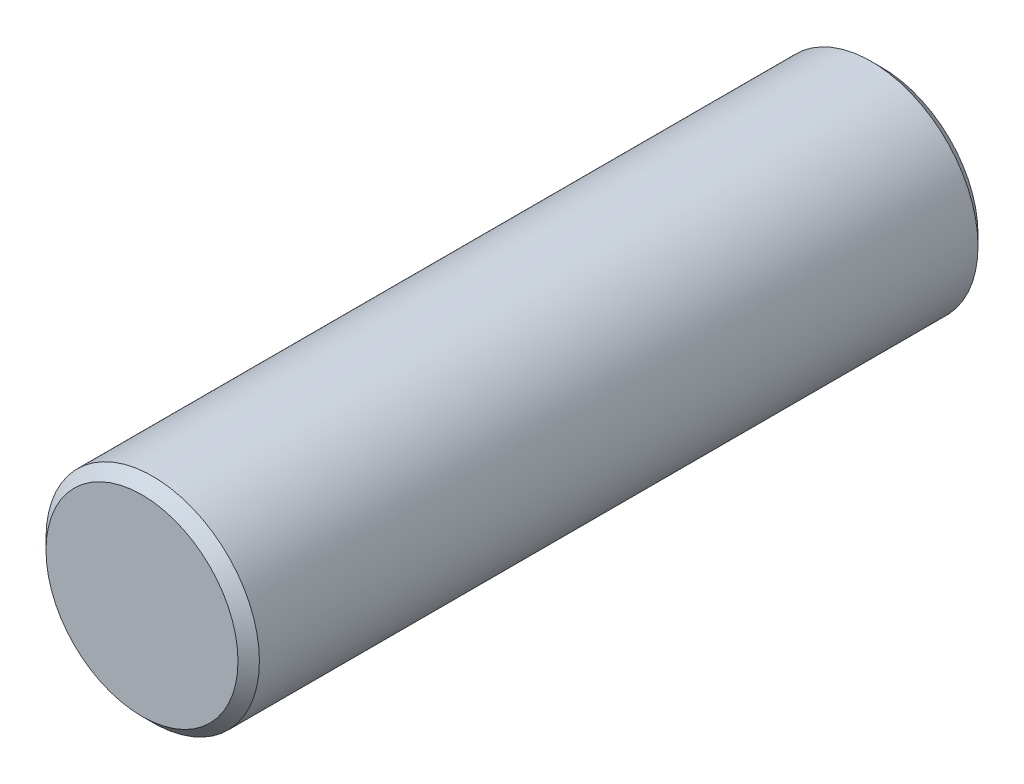
ISO-10303-21;
HEADER;
FILE_DESCRIPTION(('STEP AP214'),'2;1');
FILE_NAME('part.step','',(''),(''),'','','');
FILE_SCHEMA(('AUTOMOTIVE_DESIGN { 1 0 10303 214 1 1 1 1 }'));
ENDSEC;
DATA;
#1=APPLICATION_CONTEXT('core data for automotive mechanical design processes');
#2=APPLICATION_PROTOCOL_DEFINITION('international standard','automotive_design',2000,#1);
#3=PRODUCT_CONTEXT('',#1,'mechanical');
#4=PRODUCT('Part','Part','',(#3));
#5=PRODUCT_RELATED_PRODUCT_CATEGORY('part','',(#4));
#6=PRODUCT_DEFINITION_FORMATION('','',#4);
#7=PRODUCT_DEFINITION_CONTEXT('part definition',#1,'design');
#8=PRODUCT_DEFINITION('design','',#6,#7);
#9=PRODUCT_DEFINITION_SHAPE('','',#8);
#10=(LENGTH_UNIT() NAMED_UNIT(*) SI_UNIT(.MILLI.,.METRE.));
#11=(NAMED_UNIT(*) PLANE_ANGLE_UNIT() SI_UNIT($,.RADIAN.));
#12=(NAMED_UNIT(*) SI_UNIT($,.STERADIAN.) SOLID_ANGLE_UNIT());
#13=UNCERTAINTY_MEASURE_WITH_UNIT(LENGTH_MEASURE(1.E-05),#10,'distance_accuracy_value','');
#14=(GEOMETRIC_REPRESENTATION_CONTEXT(3) GLOBAL_UNCERTAINTY_ASSIGNED_CONTEXT((#13)) GLOBAL_UNIT_ASSIGNED_CONTEXT((#10,
#11,#12)) REPRESENTATION_CONTEXT('',''));
#15=CARTESIAN_POINT('',(0.,0.,0.));
#16=DIRECTION('',(0.,0.,1.));
#17=DIRECTION('',(1.,0.,0.));
#18=AXIS2_PLACEMENT_3D('',#15,#16,#17);
#19=CARTESIAN_POINT('',(0.,0.,6.9));
#20=DIRECTION('',(0.,0.,-1.));
#21=DIRECTION('',(-1.,0.,0.));
#22=AXIS2_PLACEMENT_3D('',#19,#20,#21);
#23=CYLINDRICAL_SURFACE('',#22,1.99);
#24=CARTESIAN_POINT('',(0.,0.,-6.69999999999999));
#25=DIRECTION('',(0.,0.,1.));
#26=DIRECTION('',(1.,0.,0.));
#27=AXIS2_PLACEMENT_3D('',#24,#25,#26);
#28=CIRCLE('',#27,1.99);
#29=CARTESIAN_POINT('',(-1.99,0.,-6.69999999999999));
#30=VERTEX_POINT('',#29);
#31=EDGE_CURVE('E42',#30,#30,#28,.T.);
#32=CARTESIAN_POINT('',(0.,0.,6.70000000000001));
#33=DIRECTION('',(0.,0.,1.));
#34=DIRECTION('',(1.,0.,0.));
#35=AXIS2_PLACEMENT_3D('',#32,#33,#34);
#36=CIRCLE('',#35,1.99);
#37=CARTESIAN_POINT('',(-1.99,0.,6.70000000000001));
#38=VERTEX_POINT('',#37);
#39=EDGE_CURVE('E46',#38,#38,#36,.F.);
#40=CARTESIAN_POINT('',(-1.99,0.,-6.69999999999999));
#41=CARTESIAN_POINT('',(-1.99,0.,-6.56041666666665));
#42=CARTESIAN_POINT('',(-1.99,0.,-6.42083333333332));
#43=CARTESIAN_POINT('',(-1.99,0.,-6.14166666666666));
#44=CARTESIAN_POINT('',(-1.99,0.,-6.00208333333332));
#45=CARTESIAN_POINT('',(-1.99,0.,-5.72291666666665));
#46=CARTESIAN_POINT('',(-1.99,0.,-5.58333333333332));
#47=CARTESIAN_POINT('',(-1.99,0.,-5.30416666666665));
#48=CARTESIAN_POINT('',(-1.99,0.,-5.16458333333332));
#49=CARTESIAN_POINT('',(-1.99,0.,-4.88541666666666));
#50=CARTESIAN_POINT('',(-1.99,0.,-4.74583333333332));
#51=CARTESIAN_POINT('',(-1.99,0.,-4.46666666666665));
#52=CARTESIAN_POINT('',(-1.99,0.,-4.32708333333332));
#53=CARTESIAN_POINT('',(-1.99,0.,-4.04791666666665));
#54=CARTESIAN_POINT('',(-1.99,0.,-3.90833333333332));
#55=CARTESIAN_POINT('',(-1.99,0.,-3.62916666666665));
#56=CARTESIAN_POINT('',(-1.99,0.,-3.48958333333332));
#57=CARTESIAN_POINT('',(-1.99,0.,-3.21041666666665));
#58=CARTESIAN_POINT('',(-1.99,0.,-3.07083333333332));
#59=CARTESIAN_POINT('',(-1.99,0.,-2.79166666666665));
#60=CARTESIAN_POINT('',(-1.99,0.,-2.65208333333332));
#61=CARTESIAN_POINT('',(-1.99,0.,-2.37291666666665));
#62=CARTESIAN_POINT('',(-1.99,0.,-2.23333333333332));
#63=CARTESIAN_POINT('',(-1.99,0.,-1.95416666666666));
#64=CARTESIAN_POINT('',(-1.99,0.,-1.81458333333332));
#65=CARTESIAN_POINT('',(-1.99,0.,-1.53541666666665));
#66=CARTESIAN_POINT('',(-1.99,0.,-1.39583333333332));
#67=CARTESIAN_POINT('',(-1.99,0.,-1.11666666666665));
#68=CARTESIAN_POINT('',(-1.99,0.,-0.977083333333321));
#69=CARTESIAN_POINT('',(-1.99,0.,-0.697916666666655));
#70=CARTESIAN_POINT('',(-1.99,0.,-0.558333333333322));
#71=CARTESIAN_POINT('',(-1.99,0.,-0.279166666666655));
#72=CARTESIAN_POINT('',(-1.99,0.,-0.139583333333322));
#73=CARTESIAN_POINT('',(-1.99,0.,0.139583333333345));
#74=CARTESIAN_POINT('',(-1.99,0.,0.279166666666678));
#75=CARTESIAN_POINT('',(-1.99,0.,0.558333333333344));
#76=CARTESIAN_POINT('',(-1.99,0.,0.697916666666678));
#77=CARTESIAN_POINT('',(-1.99,0.,0.977083333333344));
#78=CARTESIAN_POINT('',(-1.99,0.,1.11666666666668));
#79=CARTESIAN_POINT('',(-1.99,0.,1.39583333333334));
#80=CARTESIAN_POINT('',(-1.99,0.,1.53541666666668));
#81=CARTESIAN_POINT('',(-1.99,0.,1.81458333333334));
#82=CARTESIAN_POINT('',(-1.99,0.,1.95416666666668));
#83=CARTESIAN_POINT('',(-1.99,0.,2.23333333333334));
#84=CARTESIAN_POINT('',(-1.99,0.,2.37291666666668));
#85=CARTESIAN_POINT('',(-1.99,0.,2.65208333333334));
#86=CARTESIAN_POINT('',(-1.99,0.,2.79166666666668));
#87=CARTESIAN_POINT('',(-1.99,0.,3.07083333333334));
#88=CARTESIAN_POINT('',(-1.99,0.,3.21041666666668));
#89=CARTESIAN_POINT('',(-1.99,0.,3.48958333333334));
#90=CARTESIAN_POINT('',(-1.99,0.,3.62916666666668));
#91=CARTESIAN_POINT('',(-1.99,0.,3.90833333333334));
#92=CARTESIAN_POINT('',(-1.99,0.,4.04791666666668));
#93=CARTESIAN_POINT('',(-1.99,0.,4.32708333333334));
#94=CARTESIAN_POINT('',(-1.99,0.,4.46666666666668));
#95=CARTESIAN_POINT('',(-1.99,0.,4.74583333333335));
#96=CARTESIAN_POINT('',(-1.99,0.,4.88541666666668));
#97=CARTESIAN_POINT('',(-1.99,0.,5.16458333333334));
#98=CARTESIAN_POINT('',(-1.99,0.,5.30416666666668));
#99=CARTESIAN_POINT('',(-1.99,0.,5.58333333333334));
#100=CARTESIAN_POINT('',(-1.99,0.,5.72291666666668));
#101=CARTESIAN_POINT('',(-1.99,0.,6.00208333333334));
#102=CARTESIAN_POINT('',(-1.99,0.,6.14166666666668));
#103=CARTESIAN_POINT('',(-1.99,0.,6.42083333333334));
#104=CARTESIAN_POINT('',(-1.99,0.,6.56041666666668));
#105=CARTESIAN_POINT('',(-1.99,0.,6.70000000000001));
#106=B_SPLINE_CURVE_WITH_KNOTS('',3,(#40,#41,#42,#43,#44,#45,#46,#47,#48,#49,#50,#51,#52,#53,
#54,#55,#56,#57,#58,#59,#60,#61,#62,#63,#64,#65,#66,#67,#68,#69,#70,#71,#72,#73,#74,#75,#76,#77,
#78,#79,#80,#81,#82,#83,#84,#85,#86,#87,#88,#89,#90,#91,#92,#93,#94,#95,#96,#97,#98,#99,#100,
#101,#102,#103,#104,#105),.UNSPECIFIED.,.F.,.F.,(4,2,2,2,2,2,2,2,2,2,2,2,2,2,2,2,2,2,2,2,2,2,2,
2,2,2,2,2,2,2,2,2,4),(0.,0.418750000000001,0.8375,1.25625,1.675,2.09375,2.5125,2.93125,3.35,
3.76875,4.1875,4.60625,5.025,5.44375,5.8625,6.28125,6.7,7.11875,7.5375,7.95625,8.375,8.79375,
9.2125,9.63125,10.05,10.46875,10.8875,11.30625,11.725,12.14375,12.5625,12.98125,13.4),.UNSPECIFIED.);
#107=EDGE_CURVE('BSEAM31',#30,#38,#106,.T.);
#108=ORIENTED_EDGE('',*,*,#31,.T.);
#109=ORIENTED_EDGE('',*,*,#39,.T.);
#110=ORIENTED_EDGE('',*,*,#107,.T.);
#111=ORIENTED_EDGE('',*,*,#107,.F.);
#112=EDGE_LOOP('',(#108,#110,#109,#111));
#113=FACE_BOUND('',#112,.T.);
#114=ADVANCED_FACE('F31',(#113),#23,.T.);
#115=CARTESIAN_POINT('',(0.,0.,6.9));
#116=DIRECTION('',(0.,0.,1.));
#117=DIRECTION('',(1.,0.,0.));
#118=AXIS2_PLACEMENT_3D('',#115,#116,#117);
#119=PLANE('',#118);
#120=CARTESIAN_POINT('',(0.,0.,6.9));
#121=DIRECTION('',(0.,0.,1.));
#122=DIRECTION('',(1.,0.,0.));
#123=AXIS2_PLACEMENT_3D('',#120,#121,#122);
#124=CIRCLE('',#123,1.79000000000001);
#125=CARTESIAN_POINT('',(1.79000000000001,0.,6.9));
#126=VERTEX_POINT('',#125);
#127=EDGE_CURVE('E10',#126,#126,#124,.T.);
#128=ORIENTED_EDGE('',*,*,#127,.T.);
#129=EDGE_LOOP('',(#128));
#130=FACE_BOUND('',#129,.T.);
#131=ADVANCED_FACE('F62',(#130),#119,.T.);
#132=CARTESIAN_POINT('',(0.,0.,-6.9));
#133=DIRECTION('',(0.,0.,1.));
#134=DIRECTION('',(1.,0.,0.));
#135=AXIS2_PLACEMENT_3D('',#132,#133,#134);
#136=PLANE('',#135);
#137=CARTESIAN_POINT('',(0.,0.,-6.9));
#138=DIRECTION('',(0.,0.,1.));
#139=DIRECTION('',(1.,0.,0.));
#140=AXIS2_PLACEMENT_3D('',#137,#138,#139);
#141=CIRCLE('',#140,1.78999999999999);
#142=CARTESIAN_POINT('',(1.78999999999999,0.,-6.9));
#143=VERTEX_POINT('',#142);
#144=EDGE_CURVE('E38',#143,#143,#141,.F.);
#145=ORIENTED_EDGE('',*,*,#144,.T.);
#146=EDGE_LOOP('',(#145));
#147=FACE_BOUND('',#146,.T.);
#148=ADVANCED_FACE('F59',(#147),#136,.F.);
#149=CARTESIAN_POINT('',(0.,0.,-6.69999999999999));
#150=DIRECTION('',(0.,0.,1.));
#151=DIRECTION('',(1.,0.,0.));
#152=AXIS2_PLACEMENT_3D('',#149,#150,#151);
#153=CONICAL_SURFACE('',#152,1.99,0.785398163397447);
#154=ORIENTED_EDGE('',*,*,#144,.F.);
#155=EDGE_LOOP('',(#154));
#156=FACE_BOUND('',#155,.T.);
#157=ORIENTED_EDGE('',*,*,#31,.F.);
#158=EDGE_LOOP('',(#157));
#159=FACE_BOUND('',#158,.T.);
#160=ADVANCED_FACE('F55',(#156,#159),#153,.T.);
#161=CARTESIAN_POINT('',(0.,0.,6.9));
#162=DIRECTION('',(0.,0.,-1.));
#163=DIRECTION('',(-1.,0.,0.));
#164=AXIS2_PLACEMENT_3D('',#161,#162,#163);
#165=CONICAL_SURFACE('',#164,1.79000000000001,0.785398163397448);
#166=ORIENTED_EDGE('',*,*,#39,.F.);
#167=EDGE_LOOP('',(#166));
#168=FACE_BOUND('',#167,.T.);
#169=ORIENTED_EDGE('',*,*,#127,.F.);
#170=EDGE_LOOP('',(#169));
#171=FACE_BOUND('',#170,.T.);
#172=ADVANCED_FACE('F33',(#168,#171),#165,.T.);
#173=CLOSED_SHELL('',(#114,#131,#148,#160,#172));
#174=MANIFOLD_SOLID_BREP('B2',#173);
#175=ADVANCED_BREP_SHAPE_REPRESENTATION('',(#18,#174),#14);
#176=SHAPE_DEFINITION_REPRESENTATION(#9,#175);
ENDSEC;
END-ISO-10303-21;
